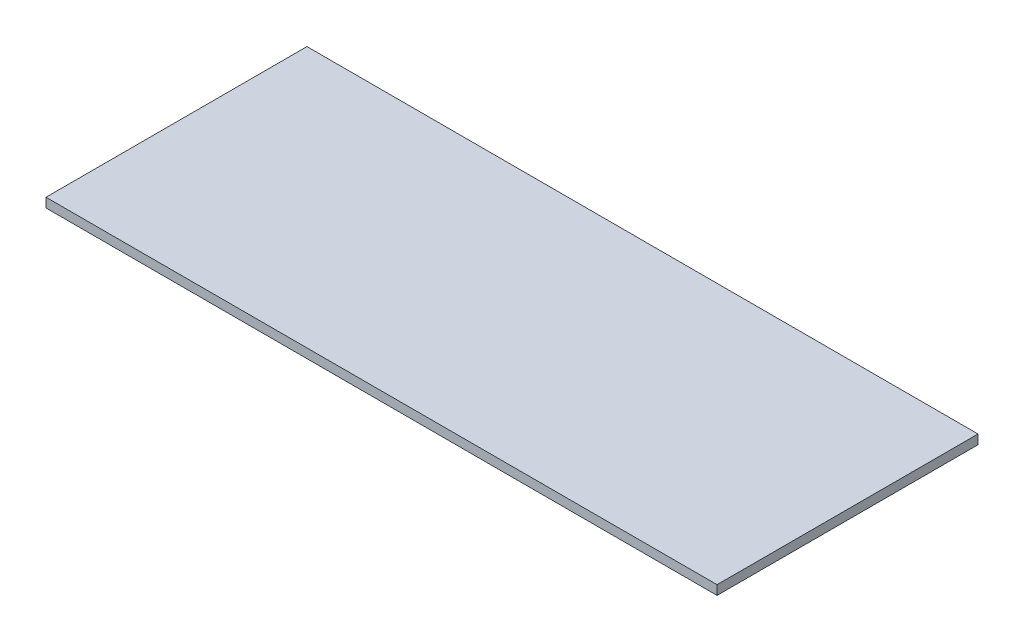
ISO-10303-21;
HEADER;
FILE_DESCRIPTION(('STEP AP214'),'2;1');
FILE_NAME('part.step','',(''),(''),'','','');
FILE_SCHEMA(('AUTOMOTIVE_DESIGN { 1 0 10303 214 1 1 1 1 }'));
ENDSEC;
DATA;
#1=APPLICATION_CONTEXT('core data for automotive mechanical design processes');
#2=APPLICATION_PROTOCOL_DEFINITION('international standard','automotive_design',2000,#1);
#3=PRODUCT_CONTEXT('',#1,'mechanical');
#4=PRODUCT('Part','Part','',(#3));
#5=PRODUCT_RELATED_PRODUCT_CATEGORY('part','',(#4));
#6=PRODUCT_DEFINITION_FORMATION('','',#4);
#7=PRODUCT_DEFINITION_CONTEXT('part definition',#1,'design');
#8=PRODUCT_DEFINITION('design','',#6,#7);
#9=PRODUCT_DEFINITION_SHAPE('','',#8);
#10=(LENGTH_UNIT() NAMED_UNIT(*) SI_UNIT(.MILLI.,.METRE.));
#11=(NAMED_UNIT(*) PLANE_ANGLE_UNIT() SI_UNIT($,.RADIAN.));
#12=(NAMED_UNIT(*) SI_UNIT($,.STERADIAN.) SOLID_ANGLE_UNIT());
#13=UNCERTAINTY_MEASURE_WITH_UNIT(LENGTH_MEASURE(1.E-05),#10,'distance_accuracy_value','');
#14=(GEOMETRIC_REPRESENTATION_CONTEXT(3) GLOBAL_UNCERTAINTY_ASSIGNED_CONTEXT((#13)) GLOBAL_UNIT_ASSIGNED_CONTEXT((#10,
#11,#12)) REPRESENTATION_CONTEXT('',''));
#15=CARTESIAN_POINT('',(0.,0.,0.));
#16=DIRECTION('',(0.,0.,1.));
#17=DIRECTION('',(1.,0.,0.));
#18=AXIS2_PLACEMENT_3D('',#15,#16,#17);
#19=CARTESIAN_POINT('',(-228.6,6.35,88.9));
#20=DIRECTION('',(-1.,0.,0.));
#21=DIRECTION('',(0.,0.,1.));
#22=AXIS2_PLACEMENT_3D('',#19,#20,#21);
#23=PLANE('',#22);
#24=DIRECTION('',(0.,0.,-1.));
#25=VECTOR('',#24,1.);
#26=CARTESIAN_POINT('',(-228.6,0.,88.9));
#27=LINE('',#26,#25);
#28=CARTESIAN_POINT('',(-228.6,0.,88.9));
#29=VERTEX_POINT('',#28);
#30=CARTESIAN_POINT('',(-228.6,0.,-88.9));
#31=VERTEX_POINT('',#30);
#32=EDGE_CURVE('E110',#29,#31,#27,.T.);
#33=ORIENTED_EDGE('',*,*,#32,.F.);
#34=DIRECTION('',(0.,-1.,0.));
#35=VECTOR('',#34,1.);
#36=CARTESIAN_POINT('',(-228.6,6.35,88.9));
#37=LINE('',#36,#35);
#38=CARTESIAN_POINT('',(-228.6,6.35,88.9));
#39=VERTEX_POINT('',#38);
#40=EDGE_CURVE('E11',#39,#29,#37,.T.);
#41=ORIENTED_EDGE('',*,*,#40,.F.);
#42=DIRECTION('',(0.,0.,-1.));
#43=VECTOR('',#42,1.);
#44=CARTESIAN_POINT('',(-228.6,6.35,88.9));
#45=LINE('',#44,#43);
#46=CARTESIAN_POINT('',(-228.6,6.35,-88.9));
#47=VERTEX_POINT('',#46);
#48=EDGE_CURVE('E103',#39,#47,#45,.T.);
#49=ORIENTED_EDGE('',*,*,#48,.T.);
#50=DIRECTION('',(0.,-1.,0.));
#51=VECTOR('',#50,1.);
#52=CARTESIAN_POINT('',(-228.6,6.35,-88.9));
#53=LINE('',#52,#51);
#54=EDGE_CURVE('E42',#47,#31,#53,.T.);
#55=ORIENTED_EDGE('',*,*,#54,.T.);
#56=EDGE_LOOP('',(#33,#41,#49,#55));
#57=FACE_BOUND('',#56,.T.);
#58=ADVANCED_FACE('F39',(#57),#23,.T.);
#59=CARTESIAN_POINT('',(-228.6,6.35,88.9));
#60=DIRECTION('',(0.,0.,-1.));
#61=DIRECTION('',(-1.,0.,0.));
#62=AXIS2_PLACEMENT_3D('',#59,#60,#61);
#63=PLANE('',#62);
#64=DIRECTION('',(1.,0.,0.));
#65=VECTOR('',#64,1.);
#66=CARTESIAN_POINT('',(-228.6,0.,88.9));
#67=LINE('',#66,#65);
#68=CARTESIAN_POINT('',(228.6,0.,88.9));
#69=VERTEX_POINT('',#68);
#70=EDGE_CURVE('E73',#29,#69,#67,.T.);
#71=ORIENTED_EDGE('',*,*,#70,.T.);
#72=DIRECTION('',(0.,-1.,0.));
#73=VECTOR('',#72,1.);
#74=CARTESIAN_POINT('',(228.6,6.35,88.9));
#75=LINE('',#74,#73);
#76=CARTESIAN_POINT('',(228.6,6.35,88.9));
#77=VERTEX_POINT('',#76);
#78=EDGE_CURVE('E49',#77,#69,#75,.T.);
#79=ORIENTED_EDGE('',*,*,#78,.F.);
#80=DIRECTION('',(1.,0.,0.));
#81=VECTOR('',#80,1.);
#82=CARTESIAN_POINT('',(-228.6,6.35,88.9));
#83=LINE('',#82,#81);
#84=EDGE_CURVE('E90',#39,#77,#83,.T.);
#85=ORIENTED_EDGE('',*,*,#84,.F.);
#86=ORIENTED_EDGE('',*,*,#40,.T.);
#87=EDGE_LOOP('',(#71,#79,#85,#86));
#88=FACE_BOUND('',#87,.T.);
#89=ADVANCED_FACE('F126',(#88),#63,.F.);
#90=CARTESIAN_POINT('',(228.6,6.35,88.9));
#91=DIRECTION('',(-1.,0.,0.));
#92=DIRECTION('',(0.,0.,1.));
#93=AXIS2_PLACEMENT_3D('',#90,#91,#92);
#94=PLANE('',#93);
#95=DIRECTION('',(0.,0.,-1.));
#96=VECTOR('',#95,1.);
#97=CARTESIAN_POINT('',(228.6,0.,88.9));
#98=LINE('',#97,#96);
#99=CARTESIAN_POINT('',(228.6,0.,-88.9));
#100=VERTEX_POINT('',#99);
#101=EDGE_CURVE('E98',#69,#100,#98,.T.);
#102=ORIENTED_EDGE('',*,*,#101,.T.);
#103=DIRECTION('',(0.,-1.,0.));
#104=VECTOR('',#103,1.);
#105=CARTESIAN_POINT('',(228.6,6.35,-88.9));
#106=LINE('',#105,#104);
#107=CARTESIAN_POINT('',(228.6,6.35,-88.9));
#108=VERTEX_POINT('',#107);
#109=EDGE_CURVE('E95',#108,#100,#106,.T.);
#110=ORIENTED_EDGE('',*,*,#109,.F.);
#111=DIRECTION('',(0.,0.,-1.));
#112=VECTOR('',#111,1.);
#113=CARTESIAN_POINT('',(228.6,6.35,88.9));
#114=LINE('',#113,#112);
#115=EDGE_CURVE('E85',#77,#108,#114,.T.);
#116=ORIENTED_EDGE('',*,*,#115,.F.);
#117=ORIENTED_EDGE('',*,*,#78,.T.);
#118=EDGE_LOOP('',(#102,#110,#116,#117));
#119=FACE_BOUND('',#118,.T.);
#120=ADVANCED_FACE('F96',(#119),#94,.F.);
#121=CARTESIAN_POINT('',(-228.6,6.35,-88.9));
#122=DIRECTION('',(0.,0.,-1.));
#123=DIRECTION('',(-1.,0.,0.));
#124=AXIS2_PLACEMENT_3D('',#121,#122,#123);
#125=PLANE('',#124);
#126=DIRECTION('',(1.,0.,0.));
#127=VECTOR('',#126,1.);
#128=CARTESIAN_POINT('',(-228.6,0.,-88.9));
#129=LINE('',#128,#127);
#130=EDGE_CURVE('E114',#31,#100,#129,.T.);
#131=ORIENTED_EDGE('',*,*,#130,.F.);
#132=ORIENTED_EDGE('',*,*,#54,.F.);
#133=DIRECTION('',(1.,0.,0.));
#134=VECTOR('',#133,1.);
#135=CARTESIAN_POINT('',(-228.6,6.35,-88.9));
#136=LINE('',#135,#134);
#137=EDGE_CURVE('E89',#47,#108,#136,.T.);
#138=ORIENTED_EDGE('',*,*,#137,.T.);
#139=ORIENTED_EDGE('',*,*,#109,.T.);
#140=EDGE_LOOP('',(#131,#132,#138,#139));
#141=FACE_BOUND('',#140,.T.);
#142=ADVANCED_FACE('F101',(#141),#125,.T.);
#143=CARTESIAN_POINT('',(0.,6.35,0.));
#144=DIRECTION('',(0.,-1.,0.));
#145=DIRECTION('',(0.,0.,-1.));
#146=AXIS2_PLACEMENT_3D('',#143,#144,#145);
#147=PLANE('',#146);
#148=ORIENTED_EDGE('',*,*,#48,.F.);
#149=ORIENTED_EDGE('',*,*,#84,.T.);
#150=ORIENTED_EDGE('',*,*,#115,.T.);
#151=ORIENTED_EDGE('',*,*,#137,.F.);
#152=EDGE_LOOP('',(#148,#149,#150,#151));
#153=FACE_BOUND('',#152,.T.);
#154=ADVANCED_FACE('F88',(#153),#147,.F.);
#155=CARTESIAN_POINT('',(0.,0.,0.));
#156=DIRECTION('',(0.,-1.,0.));
#157=DIRECTION('',(0.,0.,-1.));
#158=AXIS2_PLACEMENT_3D('',#155,#156,#157);
#159=PLANE('',#158);
#160=ORIENTED_EDGE('',*,*,#32,.T.);
#161=ORIENTED_EDGE('',*,*,#130,.T.);
#162=ORIENTED_EDGE('',*,*,#101,.F.);
#163=ORIENTED_EDGE('',*,*,#70,.F.);
#164=EDGE_LOOP('',(#160,#161,#162,#163));
#165=FACE_BOUND('',#164,.T.);
#166=ADVANCED_FACE('F123',(#165),#159,.T.);
#167=CLOSED_SHELL('',(#58,#89,#120,#142,#154,#166));
#168=MANIFOLD_SOLID_BREP('B2',#167);
#169=ADVANCED_BREP_SHAPE_REPRESENTATION('',(#18,#168),#14);
#170=SHAPE_DEFINITION_REPRESENTATION(#9,#169);
ENDSEC;
END-ISO-10303-21;
